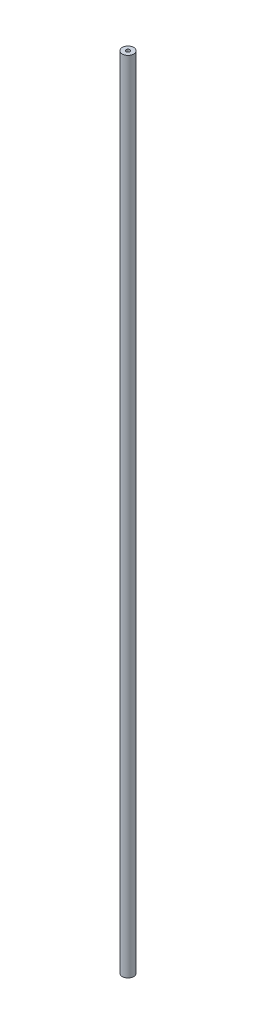
ISO-10303-21;
HEADER;
FILE_DESCRIPTION(('STEP AP214'),'2;1');
FILE_NAME('part.step','',(''),(''),'','','');
FILE_SCHEMA(('AUTOMOTIVE_DESIGN { 1 0 10303 214 1 1 1 1 }'));
ENDSEC;
DATA;
#1=APPLICATION_CONTEXT('core data for automotive mechanical design processes');
#2=APPLICATION_PROTOCOL_DEFINITION('international standard','automotive_design',2000,#1);
#3=PRODUCT_CONTEXT('',#1,'mechanical');
#4=PRODUCT('Part','Part','',(#3));
#5=PRODUCT_RELATED_PRODUCT_CATEGORY('part','',(#4));
#6=PRODUCT_DEFINITION_FORMATION('','',#4);
#7=PRODUCT_DEFINITION_CONTEXT('part definition',#1,'design');
#8=PRODUCT_DEFINITION('design','',#6,#7);
#9=PRODUCT_DEFINITION_SHAPE('','',#8);
#10=(LENGTH_UNIT() NAMED_UNIT(*) SI_UNIT(.MILLI.,.METRE.));
#11=(NAMED_UNIT(*) PLANE_ANGLE_UNIT() SI_UNIT($,.RADIAN.));
#12=(NAMED_UNIT(*) SI_UNIT($,.STERADIAN.) SOLID_ANGLE_UNIT());
#13=UNCERTAINTY_MEASURE_WITH_UNIT(LENGTH_MEASURE(1.E-05),#10,'distance_accuracy_value','');
#14=(GEOMETRIC_REPRESENTATION_CONTEXT(3) GLOBAL_UNCERTAINTY_ASSIGNED_CONTEXT((#13)) GLOBAL_UNIT_ASSIGNED_CONTEXT((#10,
#11,#12)) REPRESENTATION_CONTEXT('',''));
#15=CARTESIAN_POINT('',(0.,0.,0.));
#16=DIRECTION('',(0.,0.,1.));
#17=DIRECTION('',(1.,0.,0.));
#18=AXIS2_PLACEMENT_3D('',#15,#16,#17);
#19=CARTESIAN_POINT('',(0.,1104.9,0.));
#20=DIRECTION('',(0.,-1.,0.));
#21=DIRECTION('',(0.,0.,-1.));
#22=AXIS2_PLACEMENT_3D('',#19,#20,#21);
#23=CYLINDRICAL_SURFACE('',#22,7.9375);
#24=CARTESIAN_POINT('',(0.,1104.9,0.));
#25=DIRECTION('',(0.,1.,0.));
#26=DIRECTION('',(0.,0.,1.));
#27=AXIS2_PLACEMENT_3D('',#24,#25,#26);
#28=CIRCLE('',#27,7.9375);
#29=CARTESIAN_POINT('',(0.,1104.9,7.9375));
#30=VERTEX_POINT('',#29);
#31=EDGE_CURVE('E11',#30,#30,#28,.T.);
#32=ORIENTED_EDGE('',*,*,#31,.F.);
#33=EDGE_LOOP('',(#32));
#34=FACE_BOUND('',#33,.T.);
#35=CARTESIAN_POINT('',(0.,0.,0.));
#36=DIRECTION('',(0.,1.,0.));
#37=DIRECTION('',(0.,0.,1.));
#38=AXIS2_PLACEMENT_3D('',#35,#36,#37);
#39=CIRCLE('',#38,7.9375);
#40=CARTESIAN_POINT('',(0.,0.,7.9375));
#41=VERTEX_POINT('',#40);
#42=EDGE_CURVE('E42',#41,#41,#39,.T.);
#43=ORIENTED_EDGE('',*,*,#42,.T.);
#44=EDGE_LOOP('',(#43));
#45=FACE_BOUND('',#44,.T.);
#46=ADVANCED_FACE('F39',(#34,#45),#23,.T.);
#47=CARTESIAN_POINT('',(0.,1104.9,0.));
#48=DIRECTION('',(0.,1.,0.));
#49=DIRECTION('',(0.,0.,1.));
#50=AXIS2_PLACEMENT_3D('',#47,#48,#49);
#51=PLANE('',#50);
#52=CARTESIAN_POINT('',(0.,1104.9,0.));
#53=DIRECTION('',(0.,1.,0.));
#54=DIRECTION('',(0.,0.,1.));
#55=AXIS2_PLACEMENT_3D('',#52,#53,#54);
#56=CIRCLE('',#55,2.55269999999999);
#57=CARTESIAN_POINT('',(0.,1104.9,2.55269999999999));
#58=VERTEX_POINT('',#57);
#59=EDGE_CURVE('E60',#58,#58,#56,.T.);
#60=ORIENTED_EDGE('',*,*,#59,.F.);
#61=EDGE_LOOP('',(#60));
#62=FACE_BOUND('',#61,.T.);
#63=ORIENTED_EDGE('',*,*,#31,.T.);
#64=EDGE_LOOP('',(#63));
#65=FACE_BOUND('',#64,.T.);
#66=ADVANCED_FACE('F70',(#62,#65),#51,.T.);
#67=CARTESIAN_POINT('',(0.,0.,0.));
#68=DIRECTION('',(0.,1.,0.));
#69=DIRECTION('',(0.,0.,1.));
#70=AXIS2_PLACEMENT_3D('',#67,#68,#69);
#71=PLANE('',#70);
#72=ORIENTED_EDGE('',*,*,#42,.F.);
#73=EDGE_LOOP('',(#72));
#74=FACE_BOUND('',#73,.T.);
#75=ADVANCED_FACE('F53',(#74),#71,.F.);
#76=CARTESIAN_POINT('',(0.,1081.03381690219,0.));
#77=DIRECTION('',(0.,1.,0.));
#78=DIRECTION('',(0.,0.,1.));
#79=AXIS2_PLACEMENT_3D('',#76,#77,#78);
#80=CONICAL_SURFACE('',#79,2.55269999999999,1.02974425867665);
#81=CARTESIAN_POINT('',(0.,1079.5,0.));
#82=VERTEX_POINT('',#81);
#83=VERTEX_LOOP('',#82);
#84=FACE_BOUND('',#83,.T.);
#85=CARTESIAN_POINT('',(0.,1081.03381690219,0.));
#86=DIRECTION('',(0.,1.,0.));
#87=DIRECTION('',(0.,0.,1.));
#88=AXIS2_PLACEMENT_3D('',#85,#86,#87);
#89=CIRCLE('',#88,2.55269999999999);
#90=CARTESIAN_POINT('',(0.,1081.03381690219,2.55269999999999));
#91=VERTEX_POINT('',#90);
#92=EDGE_CURVE('E57',#91,#91,#89,.T.);
#93=ORIENTED_EDGE('',*,*,#92,.T.);
#94=EDGE_LOOP('',(#93));
#95=FACE_BOUND('',#94,.T.);
#96=ADVANCED_FACE('F49',(#84,#95),#80,.F.);
#97=CARTESIAN_POINT('',(0.,1104.9,0.));
#98=DIRECTION('',(0.,1.,0.));
#99=DIRECTION('',(0.,0.,1.));
#100=AXIS2_PLACEMENT_3D('',#97,#98,#99);
#101=CYLINDRICAL_SURFACE('',#100,2.55269999999999);
#102=ORIENTED_EDGE('',*,*,#92,.F.);
#103=EDGE_LOOP('',(#102));
#104=FACE_BOUND('',#103,.T.);
#105=ORIENTED_EDGE('',*,*,#59,.T.);
#106=EDGE_LOOP('',(#105));
#107=FACE_BOUND('',#106,.T.);
#108=ADVANCED_FACE('F52',(#104,#107),#101,.F.);
#109=CLOSED_SHELL('',(#46,#66,#75,#96,#108));
#110=MANIFOLD_SOLID_BREP('B2',#109);
#111=ADVANCED_BREP_SHAPE_REPRESENTATION('',(#18,#110),#14);
#112=SHAPE_DEFINITION_REPRESENTATION(#9,#111);
ENDSEC;
END-ISO-10303-21;
